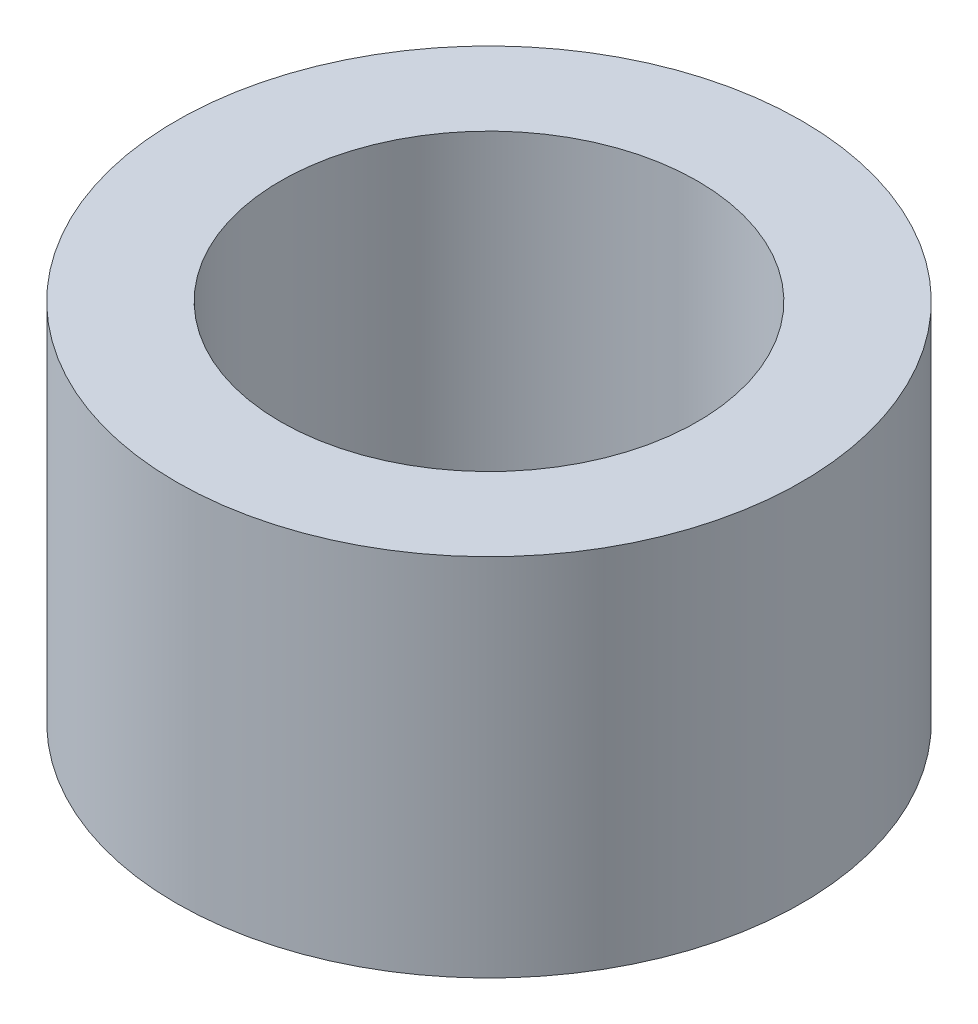
ISO-10303-21;
HEADER;
FILE_DESCRIPTION(('STEP AP214'),'2;1');
FILE_NAME('part.step','',(''),(''),'','','');
FILE_SCHEMA(('AUTOMOTIVE_DESIGN { 1 0 10303 214 1 1 1 1 }'));
ENDSEC;
DATA;
#1=APPLICATION_CONTEXT('core data for automotive mechanical design processes');
#2=APPLICATION_PROTOCOL_DEFINITION('international standard','automotive_design',2000,#1);
#3=PRODUCT_CONTEXT('',#1,'mechanical');
#4=PRODUCT('Part','Part','',(#3));
#5=PRODUCT_RELATED_PRODUCT_CATEGORY('part','',(#4));
#6=PRODUCT_DEFINITION_FORMATION('','',#4);
#7=PRODUCT_DEFINITION_CONTEXT('part definition',#1,'design');
#8=PRODUCT_DEFINITION('design','',#6,#7);
#9=PRODUCT_DEFINITION_SHAPE('','',#8);
#10=(LENGTH_UNIT() NAMED_UNIT(*) SI_UNIT(.MILLI.,.METRE.));
#11=(NAMED_UNIT(*) PLANE_ANGLE_UNIT() SI_UNIT($,.RADIAN.));
#12=(NAMED_UNIT(*) SI_UNIT($,.STERADIAN.) SOLID_ANGLE_UNIT());
#13=UNCERTAINTY_MEASURE_WITH_UNIT(LENGTH_MEASURE(1.E-05),#10,'distance_accuracy_value','');
#14=(GEOMETRIC_REPRESENTATION_CONTEXT(3) GLOBAL_UNCERTAINTY_ASSIGNED_CONTEXT((#13)) GLOBAL_UNIT_ASSIGNED_CONTEXT((#10,
#11,#12)) REPRESENTATION_CONTEXT('',''));
#15=CARTESIAN_POINT('',(0.,0.,0.));
#16=DIRECTION('',(0.,0.,1.));
#17=DIRECTION('',(1.,0.,0.));
#18=AXIS2_PLACEMENT_3D('',#15,#16,#17);
#19=CARTESIAN_POINT('',(0.,3.5,0.));
#20=DIRECTION('',(0.,1.,0.));
#21=DIRECTION('',(0.,0.,1.));
#22=AXIS2_PLACEMENT_3D('',#19,#20,#21);
#23=PLANE('',#22);
#24=CARTESIAN_POINT('',(0.,3.5,0.));
#25=DIRECTION('',(0.,1.,0.));
#26=DIRECTION('',(0.,0.,1.));
#27=AXIS2_PLACEMENT_3D('',#24,#25,#26);
#28=CIRCLE('',#27,3.);
#29=CARTESIAN_POINT('',(0.,3.5,3.));
#30=VERTEX_POINT('',#29);
#31=EDGE_CURVE('E10',#30,#30,#28,.T.);
#32=ORIENTED_EDGE('',*,*,#31,.T.);
#33=EDGE_LOOP('',(#32));
#34=FACE_BOUND('',#33,.T.);
#35=CARTESIAN_POINT('',(0.,3.5,0.));
#36=DIRECTION('',(0.,1.,0.));
#37=DIRECTION('',(0.,0.,1.));
#38=AXIS2_PLACEMENT_3D('',#35,#36,#37);
#39=CIRCLE('',#38,2.);
#40=CARTESIAN_POINT('',(0.,3.5,2.));
#41=VERTEX_POINT('',#40);
#42=EDGE_CURVE('E43',#41,#41,#39,.T.);
#43=ORIENTED_EDGE('',*,*,#42,.F.);
#44=EDGE_LOOP('',(#43));
#45=FACE_BOUND('',#44,.T.);
#46=ADVANCED_FACE('F32',(#34,#45),#23,.T.);
#47=CARTESIAN_POINT('',(0.,0.,0.));
#48=DIRECTION('',(0.,1.,0.));
#49=DIRECTION('',(0.,0.,1.));
#50=AXIS2_PLACEMENT_3D('',#47,#48,#49);
#51=PLANE('',#50);
#52=CARTESIAN_POINT('',(0.,0.,0.));
#53=DIRECTION('',(0.,1.,0.));
#54=DIRECTION('',(0.,0.,1.));
#55=AXIS2_PLACEMENT_3D('',#52,#53,#54);
#56=CIRCLE('',#55,3.);
#57=CARTESIAN_POINT('',(0.,0.,3.));
#58=VERTEX_POINT('',#57);
#59=EDGE_CURVE('E36',#58,#58,#56,.T.);
#60=ORIENTED_EDGE('',*,*,#59,.F.);
#61=EDGE_LOOP('',(#60));
#62=FACE_BOUND('',#61,.T.);
#63=CARTESIAN_POINT('',(0.,0.,0.));
#64=DIRECTION('',(0.,1.,0.));
#65=DIRECTION('',(0.,0.,1.));
#66=AXIS2_PLACEMENT_3D('',#63,#64,#65);
#67=CIRCLE('',#66,2.);
#68=CARTESIAN_POINT('',(0.,0.,2.));
#69=VERTEX_POINT('',#68);
#70=EDGE_CURVE('E45',#69,#69,#67,.T.);
#71=ORIENTED_EDGE('',*,*,#70,.T.);
#72=EDGE_LOOP('',(#71));
#73=FACE_BOUND('',#72,.T.);
#74=ADVANCED_FACE('F55',(#62,#73),#51,.F.);
#75=CARTESIAN_POINT('',(0.,3.5,0.));
#76=DIRECTION('',(0.,-1.,0.));
#77=DIRECTION('',(0.,0.,-1.));
#78=AXIS2_PLACEMENT_3D('',#75,#76,#77);
#79=CYLINDRICAL_SURFACE('',#78,3.);
#80=ORIENTED_EDGE('',*,*,#31,.F.);
#81=EDGE_LOOP('',(#80));
#82=FACE_BOUND('',#81,.T.);
#83=ORIENTED_EDGE('',*,*,#59,.T.);
#84=EDGE_LOOP('',(#83));
#85=FACE_BOUND('',#84,.T.);
#86=ADVANCED_FACE('F34',(#82,#85),#79,.T.);
#87=CARTESIAN_POINT('',(0.,3.5,0.));
#88=DIRECTION('',(0.,-1.,0.));
#89=DIRECTION('',(0.,0.,-1.));
#90=AXIS2_PLACEMENT_3D('',#87,#88,#89);
#91=CYLINDRICAL_SURFACE('',#90,2.);
#92=ORIENTED_EDGE('',*,*,#42,.T.);
#93=EDGE_LOOP('',(#92));
#94=FACE_BOUND('',#93,.T.);
#95=ORIENTED_EDGE('',*,*,#70,.F.);
#96=EDGE_LOOP('',(#95));
#97=FACE_BOUND('',#96,.T.);
#98=ADVANCED_FACE('F51',(#94,#97),#91,.F.);
#99=CLOSED_SHELL('',(#46,#74,#86,#98));
#100=MANIFOLD_SOLID_BREP('B2',#99);
#101=ADVANCED_BREP_SHAPE_REPRESENTATION('',(#18,#100),#14);
#102=SHAPE_DEFINITION_REPRESENTATION(#9,#101);
ENDSEC;
END-ISO-10303-21;
